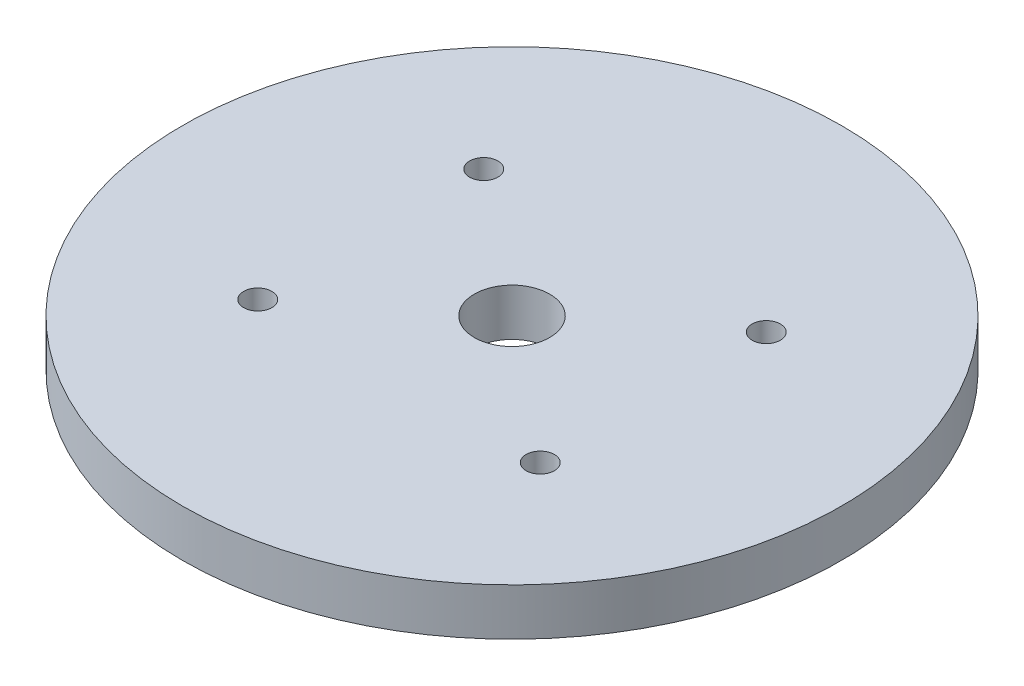
ISO-10303-21;
HEADER;
FILE_DESCRIPTION(('STEP AP214'),'2;1');
FILE_NAME('part.step','',(''),(''),'','','');
FILE_SCHEMA(('AUTOMOTIVE_DESIGN { 1 0 10303 214 1 1 1 1 }'));
ENDSEC;
DATA;
#1=APPLICATION_CONTEXT('core data for automotive mechanical design processes');
#2=APPLICATION_PROTOCOL_DEFINITION('international standard','automotive_design',2000,#1);
#3=PRODUCT_CONTEXT('',#1,'mechanical');
#4=PRODUCT('Part','Part','',(#3));
#5=PRODUCT_RELATED_PRODUCT_CATEGORY('part','',(#4));
#6=PRODUCT_DEFINITION_FORMATION('','',#4);
#7=PRODUCT_DEFINITION_CONTEXT('part definition',#1,'design');
#8=PRODUCT_DEFINITION('design','',#6,#7);
#9=PRODUCT_DEFINITION_SHAPE('','',#8);
#10=(LENGTH_UNIT() NAMED_UNIT(*) SI_UNIT(.MILLI.,.METRE.));
#11=(NAMED_UNIT(*) PLANE_ANGLE_UNIT() SI_UNIT($,.RADIAN.));
#12=(NAMED_UNIT(*) SI_UNIT($,.STERADIAN.) SOLID_ANGLE_UNIT());
#13=UNCERTAINTY_MEASURE_WITH_UNIT(LENGTH_MEASURE(1.E-05),#10,'distance_accuracy_value','');
#14=(GEOMETRIC_REPRESENTATION_CONTEXT(3) GLOBAL_UNCERTAINTY_ASSIGNED_CONTEXT((#13)) GLOBAL_UNIT_ASSIGNED_CONTEXT((#10,
#11,#12)) REPRESENTATION_CONTEXT('',''));
#15=CARTESIAN_POINT('',(0.,0.,0.));
#16=DIRECTION('',(0.,0.,1.));
#17=DIRECTION('',(1.,0.,0.));
#18=AXIS2_PLACEMENT_3D('',#15,#16,#17);
#19=CARTESIAN_POINT('',(0.,5.,0.));
#20=DIRECTION('',(0.,1.,0.));
#21=DIRECTION('',(0.,0.,1.));
#22=AXIS2_PLACEMENT_3D('',#19,#20,#21);
#23=PLANE('',#22);
#24=CARTESIAN_POINT('',(15.,5.,12.));
#25=DIRECTION('',(0.,1.,0.));
#26=DIRECTION('',(0.,0.,1.));
#27=AXIS2_PLACEMENT_3D('',#24,#25,#26);
#28=CIRCLE('',#27,1.5);
#29=CARTESIAN_POINT('',(15.,5.,13.5));
#30=VERTEX_POINT('',#29);
#31=EDGE_CURVE('E81',#30,#30,#28,.T.);
#32=ORIENTED_EDGE('',*,*,#31,.F.);
#33=EDGE_LOOP('',(#32));
#34=FACE_BOUND('',#33,.T.);
#35=CARTESIAN_POINT('',(15.,5.,-12.));
#36=DIRECTION('',(0.,1.,0.));
#37=DIRECTION('',(0.,0.,1.));
#38=AXIS2_PLACEMENT_3D('',#35,#36,#37);
#39=CIRCLE('',#38,1.5);
#40=CARTESIAN_POINT('',(15.,5.,-10.5));
#41=VERTEX_POINT('',#40);
#42=EDGE_CURVE('E83',#41,#41,#39,.T.);
#43=ORIENTED_EDGE('',*,*,#42,.F.);
#44=EDGE_LOOP('',(#43));
#45=FACE_BOUND('',#44,.T.);
#46=CARTESIAN_POINT('',(-15.,5.,-12.));
#47=DIRECTION('',(0.,1.,0.));
#48=DIRECTION('',(0.,0.,1.));
#49=AXIS2_PLACEMENT_3D('',#46,#47,#48);
#50=CIRCLE('',#49,1.5);
#51=CARTESIAN_POINT('',(-15.,5.,-10.5));
#52=VERTEX_POINT('',#51);
#53=EDGE_CURVE('E78',#52,#52,#50,.T.);
#54=ORIENTED_EDGE('',*,*,#53,.F.);
#55=EDGE_LOOP('',(#54));
#56=FACE_BOUND('',#55,.T.);
#57=CARTESIAN_POINT('',(-15.,5.,12.));
#58=DIRECTION('',(0.,1.,0.));
#59=DIRECTION('',(0.,0.,1.));
#60=AXIS2_PLACEMENT_3D('',#57,#58,#59);
#61=CIRCLE('',#60,1.5);
#62=CARTESIAN_POINT('',(-15.,5.,13.5));
#63=VERTEX_POINT('',#62);
#64=EDGE_CURVE('E65',#63,#63,#61,.T.);
#65=ORIENTED_EDGE('',*,*,#64,.F.);
#66=EDGE_LOOP('',(#65));
#67=FACE_BOUND('',#66,.T.);
#68=CARTESIAN_POINT('',(0.,5.,0.));
#69=DIRECTION('',(0.,1.,0.));
#70=DIRECTION('',(0.,0.,1.));
#71=AXIS2_PLACEMENT_3D('',#68,#69,#70);
#72=CIRCLE('',#71,35.);
#73=CARTESIAN_POINT('',(0.,5.,35.));
#74=VERTEX_POINT('',#73);
#75=EDGE_CURVE('E10',#74,#74,#72,.T.);
#76=ORIENTED_EDGE('',*,*,#75,.T.);
#77=EDGE_LOOP('',(#76));
#78=FACE_BOUND('',#77,.T.);
#79=CARTESIAN_POINT('',(0.,5.,0.));
#80=DIRECTION('',(0.,1.,0.));
#81=DIRECTION('',(0.,0.,1.));
#82=AXIS2_PLACEMENT_3D('',#79,#80,#81);
#83=CIRCLE('',#82,4.);
#84=CARTESIAN_POINT('',(0.,5.,4.));
#85=VERTEX_POINT('',#84);
#86=EDGE_CURVE('E55',#85,#85,#83,.T.);
#87=ORIENTED_EDGE('',*,*,#86,.F.);
#88=EDGE_LOOP('',(#87));
#89=FACE_BOUND('',#88,.T.);
#90=ADVANCED_FACE('F39',(#34,#45,#56,#67,#78,#89),#23,.T.);
#91=CARTESIAN_POINT('',(0.,0.,0.));
#92=DIRECTION('',(0.,1.,0.));
#93=DIRECTION('',(0.,0.,1.));
#94=AXIS2_PLACEMENT_3D('',#91,#92,#93);
#95=PLANE('',#94);
#96=CARTESIAN_POINT('',(15.,0.,12.));
#97=DIRECTION('',(0.,1.,0.));
#98=DIRECTION('',(0.,0.,1.));
#99=AXIS2_PLACEMENT_3D('',#96,#97,#98);
#100=CIRCLE('',#99,1.5);
#101=CARTESIAN_POINT('',(15.,0.,13.5));
#102=VERTEX_POINT('',#101);
#103=EDGE_CURVE('E43',#102,#102,#100,.T.);
#104=ORIENTED_EDGE('',*,*,#103,.T.);
#105=EDGE_LOOP('',(#104));
#106=FACE_BOUND('',#105,.T.);
#107=CARTESIAN_POINT('',(15.,0.,-12.));
#108=DIRECTION('',(0.,1.,0.));
#109=DIRECTION('',(0.,0.,1.));
#110=AXIS2_PLACEMENT_3D('',#107,#108,#109);
#111=CIRCLE('',#110,1.5);
#112=CARTESIAN_POINT('',(15.,0.,-10.5));
#113=VERTEX_POINT('',#112);
#114=EDGE_CURVE('E61',#113,#113,#111,.T.);
#115=ORIENTED_EDGE('',*,*,#114,.T.);
#116=EDGE_LOOP('',(#115));
#117=FACE_BOUND('',#116,.T.);
#118=CARTESIAN_POINT('',(-15.,0.,-12.));
#119=DIRECTION('',(0.,1.,0.));
#120=DIRECTION('',(0.,0.,1.));
#121=AXIS2_PLACEMENT_3D('',#118,#119,#120);
#122=CIRCLE('',#121,1.5);
#123=CARTESIAN_POINT('',(-15.,0.,-10.5));
#124=VERTEX_POINT('',#123);
#125=EDGE_CURVE('E62',#124,#124,#122,.T.);
#126=ORIENTED_EDGE('',*,*,#125,.T.);
#127=EDGE_LOOP('',(#126));
#128=FACE_BOUND('',#127,.T.);
#129=CARTESIAN_POINT('',(-15.,0.,12.));
#130=DIRECTION('',(0.,1.,0.));
#131=DIRECTION('',(0.,0.,1.));
#132=AXIS2_PLACEMENT_3D('',#129,#130,#131);
#133=CIRCLE('',#132,1.5);
#134=CARTESIAN_POINT('',(-15.,0.,13.5));
#135=VERTEX_POINT('',#134);
#136=EDGE_CURVE('E59',#135,#135,#133,.T.);
#137=ORIENTED_EDGE('',*,*,#136,.T.);
#138=EDGE_LOOP('',(#137));
#139=FACE_BOUND('',#138,.T.);
#140=CARTESIAN_POINT('',(0.,0.,0.));
#141=DIRECTION('',(0.,1.,0.));
#142=DIRECTION('',(0.,0.,1.));
#143=AXIS2_PLACEMENT_3D('',#140,#141,#142);
#144=CIRCLE('',#143,35.);
#145=CARTESIAN_POINT('',(0.,0.,35.));
#146=VERTEX_POINT('',#145);
#147=EDGE_CURVE('E50',#146,#146,#144,.T.);
#148=ORIENTED_EDGE('',*,*,#147,.F.);
#149=EDGE_LOOP('',(#148));
#150=FACE_BOUND('',#149,.T.);
#151=CARTESIAN_POINT('',(0.,0.,0.));
#152=DIRECTION('',(0.,1.,0.));
#153=DIRECTION('',(0.,0.,1.));
#154=AXIS2_PLACEMENT_3D('',#151,#152,#153);
#155=CIRCLE('',#154,4.);
#156=CARTESIAN_POINT('',(0.,0.,4.));
#157=VERTEX_POINT('',#156);
#158=EDGE_CURVE('E54',#157,#157,#155,.T.);
#159=ORIENTED_EDGE('',*,*,#158,.T.);
#160=EDGE_LOOP('',(#159));
#161=FACE_BOUND('',#160,.T.);
#162=ADVANCED_FACE('F92',(#106,#117,#128,#139,#150,#161),#95,.F.);
#163=CARTESIAN_POINT('',(0.,5.,0.));
#164=DIRECTION('',(0.,-1.,0.));
#165=DIRECTION('',(0.,0.,-1.));
#166=AXIS2_PLACEMENT_3D('',#163,#164,#165);
#167=CYLINDRICAL_SURFACE('',#166,35.);
#168=ORIENTED_EDGE('',*,*,#75,.F.);
#169=EDGE_LOOP('',(#168));
#170=FACE_BOUND('',#169,.T.);
#171=ORIENTED_EDGE('',*,*,#147,.T.);
#172=EDGE_LOOP('',(#171));
#173=FACE_BOUND('',#172,.T.);
#174=ADVANCED_FACE('F41',(#170,#173),#167,.T.);
#175=CARTESIAN_POINT('',(0.,5.,0.));
#176=DIRECTION('',(0.,-1.,0.));
#177=DIRECTION('',(0.,0.,-1.));
#178=AXIS2_PLACEMENT_3D('',#175,#176,#177);
#179=CYLINDRICAL_SURFACE('',#178,4.);
#180=ORIENTED_EDGE('',*,*,#86,.T.);
#181=EDGE_LOOP('',(#180));
#182=FACE_BOUND('',#181,.T.);
#183=ORIENTED_EDGE('',*,*,#158,.F.);
#184=EDGE_LOOP('',(#183));
#185=FACE_BOUND('',#184,.T.);
#186=ADVANCED_FACE('F102',(#182,#185),#179,.F.);
#187=CARTESIAN_POINT('',(-15.,-162.,12.));
#188=DIRECTION('',(0.,1.,0.));
#189=DIRECTION('',(0.,0.,1.));
#190=AXIS2_PLACEMENT_3D('',#187,#188,#189);
#191=CYLINDRICAL_SURFACE('',#190,1.5);
#192=ORIENTED_EDGE('',*,*,#64,.T.);
#193=EDGE_LOOP('',(#192));
#194=FACE_BOUND('',#193,.T.);
#195=ORIENTED_EDGE('',*,*,#136,.F.);
#196=EDGE_LOOP('',(#195));
#197=FACE_BOUND('',#196,.T.);
#198=ADVANCED_FACE('F101',(#194,#197),#191,.F.);
#199=CARTESIAN_POINT('',(-15.,-162.,-12.));
#200=DIRECTION('',(0.,1.,0.));
#201=DIRECTION('',(0.,0.,1.));
#202=AXIS2_PLACEMENT_3D('',#199,#200,#201);
#203=CYLINDRICAL_SURFACE('',#202,1.5);
#204=ORIENTED_EDGE('',*,*,#53,.T.);
#205=EDGE_LOOP('',(#204));
#206=FACE_BOUND('',#205,.T.);
#207=ORIENTED_EDGE('',*,*,#125,.F.);
#208=EDGE_LOOP('',(#207));
#209=FACE_BOUND('',#208,.T.);
#210=ADVANCED_FACE('F89',(#206,#209),#203,.F.);
#211=CARTESIAN_POINT('',(15.,-162.,-12.));
#212=DIRECTION('',(0.,1.,0.));
#213=DIRECTION('',(0.,0.,1.));
#214=AXIS2_PLACEMENT_3D('',#211,#212,#213);
#215=CYLINDRICAL_SURFACE('',#214,1.5);
#216=ORIENTED_EDGE('',*,*,#42,.T.);
#217=EDGE_LOOP('',(#216));
#218=FACE_BOUND('',#217,.T.);
#219=ORIENTED_EDGE('',*,*,#114,.F.);
#220=EDGE_LOOP('',(#219));
#221=FACE_BOUND('',#220,.T.);
#222=ADVANCED_FACE('F124',(#218,#221),#215,.F.);
#223=CARTESIAN_POINT('',(15.,-162.,12.));
#224=DIRECTION('',(0.,1.,0.));
#225=DIRECTION('',(0.,0.,1.));
#226=AXIS2_PLACEMENT_3D('',#223,#224,#225);
#227=CYLINDRICAL_SURFACE('',#226,1.5);
#228=ORIENTED_EDGE('',*,*,#31,.T.);
#229=EDGE_LOOP('',(#228));
#230=FACE_BOUND('',#229,.T.);
#231=ORIENTED_EDGE('',*,*,#103,.F.);
#232=EDGE_LOOP('',(#231));
#233=FACE_BOUND('',#232,.T.);
#234=ADVANCED_FACE('F125',(#230,#233),#227,.F.);
#235=CLOSED_SHELL('',(#90,#162,#174,#186,#198,#210,#222,#234));
#236=MANIFOLD_SOLID_BREP('B2',#235);
#237=ADVANCED_BREP_SHAPE_REPRESENTATION('',(#18,#236),#14);
#238=SHAPE_DEFINITION_REPRESENTATION(#9,#237);
ENDSEC;
END-ISO-10303-21;
